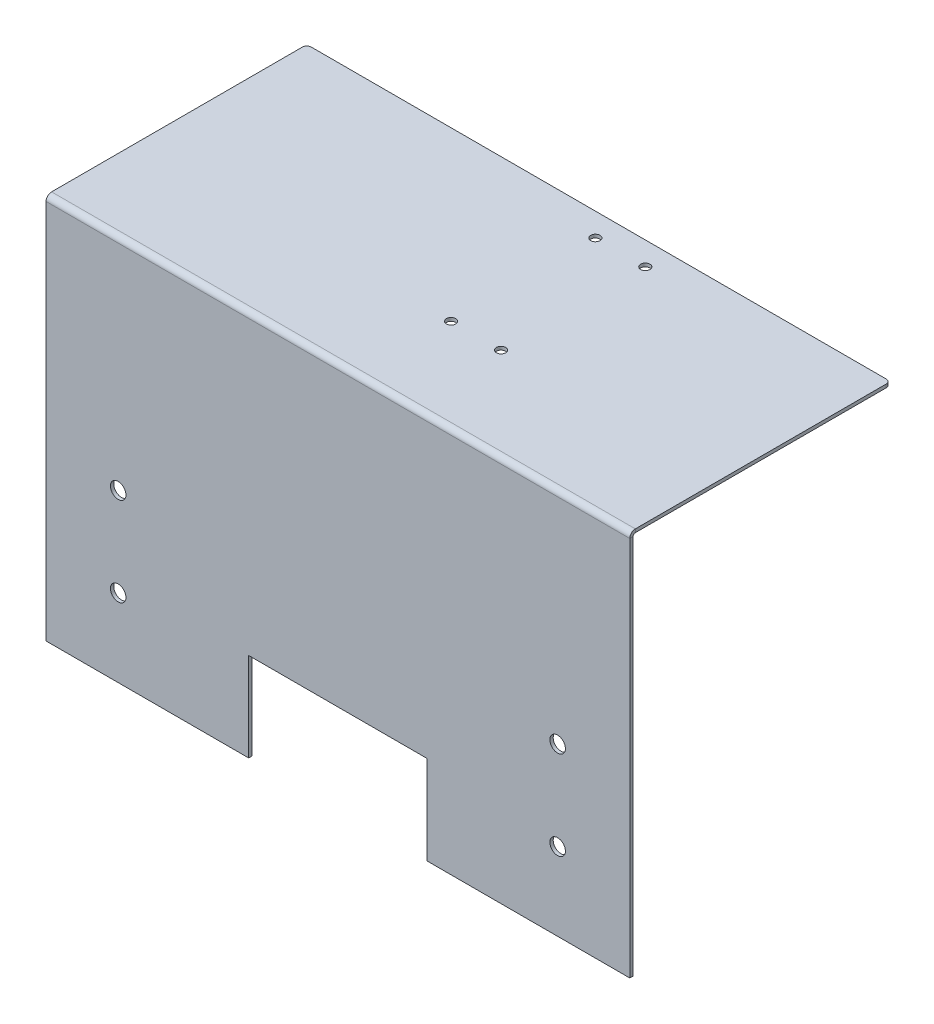
ISO-10303-21;
HEADER;
FILE_DESCRIPTION(('STEP AP214'),'2;1');
FILE_NAME('part.step','',(''),(''),'','','');
FILE_SCHEMA(('AUTOMOTIVE_DESIGN { 1 0 10303 214 1 1 1 1 }'));
ENDSEC;
DATA;
#1=APPLICATION_CONTEXT('core data for automotive mechanical design processes');
#2=APPLICATION_PROTOCOL_DEFINITION('international standard','automotive_design',2000,#1);
#3=PRODUCT_CONTEXT('',#1,'mechanical');
#4=PRODUCT('Part','Part','',(#3));
#5=PRODUCT_RELATED_PRODUCT_CATEGORY('part','',(#4));
#6=PRODUCT_DEFINITION_FORMATION('','',#4);
#7=PRODUCT_DEFINITION_CONTEXT('part definition',#1,'design');
#8=PRODUCT_DEFINITION('design','',#6,#7);
#9=PRODUCT_DEFINITION_SHAPE('','',#8);
#10=(LENGTH_UNIT() NAMED_UNIT(*) SI_UNIT(.MILLI.,.METRE.));
#11=(NAMED_UNIT(*) PLANE_ANGLE_UNIT() SI_UNIT($,.RADIAN.));
#12=(NAMED_UNIT(*) SI_UNIT($,.STERADIAN.) SOLID_ANGLE_UNIT());
#13=UNCERTAINTY_MEASURE_WITH_UNIT(LENGTH_MEASURE(1.E-05),#10,'distance_accuracy_value','');
#14=(GEOMETRIC_REPRESENTATION_CONTEXT(3) GLOBAL_UNCERTAINTY_ASSIGNED_CONTEXT((#13)) GLOBAL_UNIT_ASSIGNED_CONTEXT((#10,
#11,#12)) REPRESENTATION_CONTEXT('',''));
#15=CARTESIAN_POINT('',(0.,0.,0.));
#16=DIRECTION('',(0.,0.,1.));
#17=DIRECTION('',(1.,0.,0.));
#18=AXIS2_PLACEMENT_3D('',#15,#16,#17);
#19=CARTESIAN_POINT('',(131.5,0.,-1.5));
#20=DIRECTION('',(0.,-1.,0.));
#21=DIRECTION('',(0.,0.,-1.));
#22=AXIS2_PLACEMENT_3D('',#19,#20,#21);
#23=PLANE('',#22);
#24=DIRECTION('',(0.,0.,1.));
#25=VECTOR('',#24,1.);
#26=CARTESIAN_POINT('',(40.2,0.,-1.5));
#27=LINE('',#26,#25);
#28=CARTESIAN_POINT('',(40.2,0.,-1.50000000000003));
#29=VERTEX_POINT('',#28);
#30=CARTESIAN_POINT('',(40.2,0.,0.));
#31=VERTEX_POINT('',#30);
#32=EDGE_CURVE('E162',#29,#31,#27,.T.);
#33=ORIENTED_EDGE('',*,*,#32,.F.);
#34=DIRECTION('',(-1.,0.,0.));
#35=VECTOR('',#34,1.);
#36=CARTESIAN_POINT('',(131.5,0.,-1.5));
#37=LINE('',#36,#35);
#38=CARTESIAN_POINT('',(131.5,0.,-1.5));
#39=VERTEX_POINT('',#38);
#40=EDGE_CURVE('E251',#39,#29,#37,.T.);
#41=ORIENTED_EDGE('',*,*,#40,.F.);
#42=DIRECTION('',(0.,0.,1.));
#43=VECTOR('',#42,1.);
#44=CARTESIAN_POINT('',(131.5,0.,-1.5));
#45=LINE('',#44,#43);
#46=CARTESIAN_POINT('',(131.5,0.,0.));
#47=VERTEX_POINT('',#46);
#48=EDGE_CURVE('E217',#39,#47,#45,.T.);
#49=ORIENTED_EDGE('',*,*,#48,.T.);
#50=DIRECTION('',(-1.,0.,0.));
#51=VECTOR('',#50,1.);
#52=CARTESIAN_POINT('',(131.5,0.,0.));
#53=LINE('',#52,#51);
#54=EDGE_CURVE('E255',#47,#31,#53,.T.);
#55=ORIENTED_EDGE('',*,*,#54,.T.);
#56=EDGE_LOOP('',(#33,#41,#49,#55));
#57=FACE_BOUND('',#56,.T.);
#58=ADVANCED_FACE('F39',(#57),#23,.T.);
#59=CARTESIAN_POINT('',(131.5,0.,-1.5));
#60=DIRECTION('',(0.,0.,1.));
#61=DIRECTION('',(1.,0.,0.));
#62=AXIS2_PLACEMENT_3D('',#59,#60,#61);
#63=PLANE('',#62);
#64=ORIENTED_EDGE('',*,*,#40,.T.);
#65=DIRECTION('',(0.,1.,0.));
#66=VECTOR('',#65,1.);
#67=CARTESIAN_POINT('',(40.2,0.,-1.5));
#68=LINE('',#67,#66);
#69=CARTESIAN_POINT('',(40.2,40.,-1.50000000000003));
#70=VERTEX_POINT('',#69);
#71=EDGE_CURVE('E178',#29,#70,#68,.T.);
#72=ORIENTED_EDGE('',*,*,#71,.T.);
#73=DIRECTION('',(-1.,0.,0.));
#74=VECTOR('',#73,1.);
#75=CARTESIAN_POINT('',(131.5,40.,-1.5));
#76=LINE('',#75,#74);
#77=CARTESIAN_POINT('',(-40.2,40.,-1.50000000000003));
#78=VERTEX_POINT('',#77);
#79=EDGE_CURVE('E152',#70,#78,#76,.T.);
#80=ORIENTED_EDGE('',*,*,#79,.T.);
#81=DIRECTION('',(0.,-1.,0.));
#82=VECTOR('',#81,1.);
#83=CARTESIAN_POINT('',(-40.2,0.,-1.5));
#84=LINE('',#83,#82);
#85=CARTESIAN_POINT('',(-40.2,0.,-1.50000000000003));
#86=VERTEX_POINT('',#85);
#87=EDGE_CURVE('E174',#78,#86,#84,.T.);
#88=ORIENTED_EDGE('',*,*,#87,.T.);
#89=CARTESIAN_POINT('',(-131.5,0.,-1.5));
#90=VERTEX_POINT('',#89);
#91=EDGE_CURVE('E250',#86,#90,#37,.T.);
#92=ORIENTED_EDGE('',*,*,#91,.T.);
#93=DIRECTION('',(0.,1.,0.));
#94=VECTOR('',#93,1.);
#95=CARTESIAN_POINT('',(-131.5,0.,-1.5));
#96=LINE('',#95,#94);
#97=CARTESIAN_POINT('',(-131.5,171.5,-1.5));
#98=VERTEX_POINT('',#97);
#99=EDGE_CURVE('E240',#90,#98,#96,.T.);
#100=ORIENTED_EDGE('',*,*,#99,.T.);
#101=DIRECTION('',(-1.,0.,0.));
#102=VECTOR('',#101,1.);
#103=CARTESIAN_POINT('',(131.5,171.5,-1.5));
#104=LINE('',#103,#102);
#105=CARTESIAN_POINT('',(131.5,171.5,-1.5));
#106=VERTEX_POINT('',#105);
#107=EDGE_CURVE('E247',#106,#98,#104,.T.);
#108=ORIENTED_EDGE('',*,*,#107,.F.);
#109=DIRECTION('',(0.,1.,0.));
#110=VECTOR('',#109,1.);
#111=CARTESIAN_POINT('',(131.5,0.,-1.5));
#112=LINE('',#111,#110);
#113=EDGE_CURVE('E220',#39,#106,#112,.T.);
#114=ORIENTED_EDGE('',*,*,#113,.F.);
#115=EDGE_LOOP('',(#64,#72,#80,#88,#92,#100,#108,#114));
#116=FACE_BOUND('',#115,.T.);
#117=CARTESIAN_POINT('',(99.,75.,-1.5));
#118=DIRECTION('',(0.,0.,-1.));
#119=DIRECTION('',(-1.,0.,0.));
#120=AXIS2_PLACEMENT_3D('',#117,#118,#119);
#121=CIRCLE('',#120,3.49999999999999);
#122=CARTESIAN_POINT('',(95.5,75.,-1.5));
#123=VERTEX_POINT('',#122);
#124=EDGE_CURVE('E181',#123,#123,#121,.T.);
#125=ORIENTED_EDGE('',*,*,#124,.F.);
#126=EDGE_LOOP('',(#125));
#127=FACE_BOUND('',#126,.T.);
#128=CARTESIAN_POINT('',(-99.,75.,-1.5));
#129=DIRECTION('',(0.,0.,-1.));
#130=DIRECTION('',(-1.,0.,0.));
#131=AXIS2_PLACEMENT_3D('',#128,#129,#130);
#132=CIRCLE('',#131,3.49999999999999);
#133=CARTESIAN_POINT('',(-102.5,75.,-1.5));
#134=VERTEX_POINT('',#133);
#135=EDGE_CURVE('E199',#134,#134,#132,.T.);
#136=ORIENTED_EDGE('',*,*,#135,.F.);
#137=EDGE_LOOP('',(#136));
#138=FACE_BOUND('',#137,.T.);
#139=CARTESIAN_POINT('',(-99.,35.,-1.5));
#140=DIRECTION('',(0.,0.,-1.));
#141=DIRECTION('',(-1.,0.,0.));
#142=AXIS2_PLACEMENT_3D('',#139,#140,#141);
#143=CIRCLE('',#142,3.49999999999999);
#144=CARTESIAN_POINT('',(-102.5,35.,-1.5));
#145=VERTEX_POINT('',#144);
#146=EDGE_CURVE('E193',#145,#145,#143,.T.);
#147=ORIENTED_EDGE('',*,*,#146,.F.);
#148=EDGE_LOOP('',(#147));
#149=FACE_BOUND('',#148,.T.);
#150=CARTESIAN_POINT('',(99.,35.,-1.5));
#151=DIRECTION('',(0.,0.,-1.));
#152=DIRECTION('',(-1.,0.,0.));
#153=AXIS2_PLACEMENT_3D('',#150,#151,#152);
#154=CIRCLE('',#153,3.49999999999999);
#155=CARTESIAN_POINT('',(95.5,35.,-1.5));
#156=VERTEX_POINT('',#155);
#157=EDGE_CURVE('E187',#156,#156,#154,.T.);
#158=ORIENTED_EDGE('',*,*,#157,.F.);
#159=EDGE_LOOP('',(#158));
#160=FACE_BOUND('',#159,.T.);
#161=ADVANCED_FACE('F323',(#116,#127,#138,#149,#160),#63,.F.);
#162=CARTESIAN_POINT('',(131.5,174.,-2.5));
#163=DIRECTION('',(1.,0.,0.));
#164=DIRECTION('',(0.,0.,-1.));
#165=AXIS2_PLACEMENT_3D('',#162,#163,#164);
#166=PLANE('',#165);
#167=DIRECTION('',(0.,-1.,0.));
#168=VECTOR('',#167,1.);
#169=CARTESIAN_POINT('',(131.5,174.,-2.5));
#170=LINE('',#169,#168);
#171=CARTESIAN_POINT('',(131.5,174.,-2.5));
#172=VERTEX_POINT('',#171);
#173=CARTESIAN_POINT('',(131.5,172.5,-2.5));
#174=VERTEX_POINT('',#173);
#175=EDGE_CURVE('E274',#172,#174,#170,.T.);
#176=ORIENTED_EDGE('',*,*,#175,.F.);
#177=CARTESIAN_POINT('',(131.5,171.5,-2.5));
#178=DIRECTION('',(1.,0.,0.));
#179=DIRECTION('',(0.,0.,-1.));
#180=AXIS2_PLACEMENT_3D('',#177,#178,#179);
#181=CIRCLE('',#180,2.5);
#182=CARTESIAN_POINT('',(131.5,171.5,0.));
#183=VERTEX_POINT('',#182);
#184=EDGE_CURVE('E211',#183,#172,#181,.F.);
#185=ORIENTED_EDGE('',*,*,#184,.F.);
#186=DIRECTION('',(0.,0.,1.));
#187=VECTOR('',#186,1.);
#188=CARTESIAN_POINT('',(131.5,171.5,-1.5));
#189=LINE('',#188,#187);
#190=EDGE_CURVE('E272',#106,#183,#189,.T.);
#191=ORIENTED_EDGE('',*,*,#190,.F.);
#192=CARTESIAN_POINT('',(131.5,171.5,-2.5));
#193=DIRECTION('',(1.,0.,0.));
#194=DIRECTION('',(0.,0.,-1.));
#195=AXIS2_PLACEMENT_3D('',#192,#193,#194);
#196=CIRCLE('',#195,1.);
#197=EDGE_CURVE('E223',#106,#174,#196,.F.);
#198=ORIENTED_EDGE('',*,*,#197,.T.);
#199=EDGE_LOOP('',(#176,#185,#191,#198));
#200=FACE_BOUND('',#199,.T.);
#201=ADVANCED_FACE('F308',(#200),#166,.T.);
#202=CARTESIAN_POINT('',(131.5,171.5,-1.5));
#203=DIRECTION('',(1.,0.,0.));
#204=DIRECTION('',(0.,0.,-1.));
#205=AXIS2_PLACEMENT_3D('',#202,#203,#204);
#206=PLANE('',#205);
#207=DIRECTION('',(0.,0.,-1.));
#208=VECTOR('',#207,1.);
#209=CARTESIAN_POINT('',(131.5,172.5,0.));
#210=LINE('',#209,#208);
#211=CARTESIAN_POINT('',(131.5,172.5,-115.5));
#212=VERTEX_POINT('',#211);
#213=EDGE_CURVE('E206',#174,#212,#210,.T.);
#214=ORIENTED_EDGE('',*,*,#213,.T.);
#215=DIRECTION('',(0.,-1.,0.));
#216=VECTOR('',#215,1.);
#217=CARTESIAN_POINT('',(131.5,171.5,-115.5));
#218=LINE('',#217,#216);
#219=CARTESIAN_POINT('',(131.5,174.,-115.5));
#220=VERTEX_POINT('',#219);
#221=EDGE_CURVE('E62',#212,#220,#218,.F.);
#222=ORIENTED_EDGE('',*,*,#221,.T.);
#223=DIRECTION('',(0.,0.,-1.));
#224=VECTOR('',#223,1.);
#225=CARTESIAN_POINT('',(131.5,174.,0.));
#226=LINE('',#225,#224);
#227=EDGE_CURVE('E208',#172,#220,#226,.T.);
#228=ORIENTED_EDGE('',*,*,#227,.F.);
#229=ORIENTED_EDGE('',*,*,#175,.T.);
#230=EDGE_LOOP('',(#214,#222,#228,#229));
#231=FACE_BOUND('',#230,.T.);
#232=ADVANCED_FACE('F303',(#231),#206,.T.);
#233=CARTESIAN_POINT('',(-131.5,171.5,0.));
#234=DIRECTION('',(-1.,0.,0.));
#235=DIRECTION('',(0.,0.,1.));
#236=AXIS2_PLACEMENT_3D('',#233,#234,#235);
#237=PLANE('',#236);
#238=DIRECTION('',(0.,0.,-1.));
#239=VECTOR('',#238,1.);
#240=CARTESIAN_POINT('',(-131.5,171.5,0.));
#241=LINE('',#240,#239);
#242=CARTESIAN_POINT('',(-131.5,171.5,0.));
#243=VERTEX_POINT('',#242);
#244=EDGE_CURVE('E270',#243,#98,#241,.T.);
#245=ORIENTED_EDGE('',*,*,#244,.F.);
#246=CARTESIAN_POINT('',(-131.5,171.5,-2.5));
#247=DIRECTION('',(1.,0.,0.));
#248=DIRECTION('',(0.,0.,-1.));
#249=AXIS2_PLACEMENT_3D('',#246,#247,#248);
#250=CIRCLE('',#249,2.5);
#251=CARTESIAN_POINT('',(-131.5,174.,-2.5));
#252=VERTEX_POINT('',#251);
#253=EDGE_CURVE('E231',#243,#252,#250,.F.);
#254=ORIENTED_EDGE('',*,*,#253,.T.);
#255=DIRECTION('',(0.,1.,0.));
#256=VECTOR('',#255,1.);
#257=CARTESIAN_POINT('',(-131.5,172.5,-2.5));
#258=LINE('',#257,#256);
#259=CARTESIAN_POINT('',(-131.5,172.5,-2.5));
#260=VERTEX_POINT('',#259);
#261=EDGE_CURVE('E268',#260,#252,#258,.T.);
#262=ORIENTED_EDGE('',*,*,#261,.F.);
#263=CARTESIAN_POINT('',(-131.5,171.5,-2.5));
#264=DIRECTION('',(1.,0.,0.));
#265=DIRECTION('',(0.,0.,-1.));
#266=AXIS2_PLACEMENT_3D('',#263,#264,#265);
#267=CIRCLE('',#266,1.);
#268=EDGE_CURVE('E209',#98,#260,#267,.F.);
#269=ORIENTED_EDGE('',*,*,#268,.F.);
#270=EDGE_LOOP('',(#245,#254,#262,#269));
#271=FACE_BOUND('',#270,.T.);
#272=ADVANCED_FACE('F356',(#271),#237,.T.);
#273=CARTESIAN_POINT('',(-131.5,172.5,-2.5));
#274=DIRECTION('',(-1.,0.,0.));
#275=DIRECTION('',(0.,0.,1.));
#276=AXIS2_PLACEMENT_3D('',#273,#274,#275);
#277=PLANE('',#276);
#278=DIRECTION('',(0.,1.,0.));
#279=VECTOR('',#278,1.);
#280=CARTESIAN_POINT('',(-131.5,0.,0.));
#281=LINE('',#280,#279);
#282=CARTESIAN_POINT('',(-131.5,0.,0.));
#283=VERTEX_POINT('',#282);
#284=EDGE_CURVE('E234',#283,#243,#281,.T.);
#285=ORIENTED_EDGE('',*,*,#284,.T.);
#286=ORIENTED_EDGE('',*,*,#244,.T.);
#287=ORIENTED_EDGE('',*,*,#99,.F.);
#288=DIRECTION('',(0.,0.,1.));
#289=VECTOR('',#288,1.);
#290=CARTESIAN_POINT('',(-131.5,0.,-1.5));
#291=LINE('',#290,#289);
#292=EDGE_CURVE('E237',#90,#283,#291,.T.);
#293=ORIENTED_EDGE('',*,*,#292,.T.);
#294=EDGE_LOOP('',(#285,#286,#287,#293));
#295=FACE_BOUND('',#294,.T.);
#296=ADVANCED_FACE('F351',(#295),#277,.T.);
#297=CARTESIAN_POINT('',(131.5,172.5,0.));
#298=DIRECTION('',(0.,1.,0.));
#299=DIRECTION('',(0.,0.,1.));
#300=AXIS2_PLACEMENT_3D('',#297,#298,#299);
#301=PLANE('',#300);
#302=CARTESIAN_POINT('',(9.,172.5,-107.));
#303=DIRECTION('',(0.,1.,0.));
#304=DIRECTION('',(0.,0.,1.));
#305=AXIS2_PLACEMENT_3D('',#302,#303,#304);
#306=CIRCLE('',#305,2.1);
#307=CARTESIAN_POINT('',(9.,172.5,-104.9));
#308=VERTEX_POINT('',#307);
#309=EDGE_CURVE('E652',#308,#308,#306,.T.);
#310=ORIENTED_EDGE('',*,*,#309,.T.);
#311=EDGE_LOOP('',(#310));
#312=FACE_BOUND('',#311,.T.);
#313=CARTESIAN_POINT('',(31.5,172.5,-107.));
#314=DIRECTION('',(0.,1.,0.));
#315=DIRECTION('',(0.,0.,1.));
#316=AXIS2_PLACEMENT_3D('',#313,#314,#315);
#317=CIRCLE('',#316,2.1);
#318=CARTESIAN_POINT('',(31.5,172.5,-104.9));
#319=VERTEX_POINT('',#318);
#320=EDGE_CURVE('E648',#319,#319,#317,.T.);
#321=ORIENTED_EDGE('',*,*,#320,.T.);
#322=EDGE_LOOP('',(#321));
#323=FACE_BOUND('',#322,.T.);
#324=CARTESIAN_POINT('',(31.5,172.5,-42.));
#325=DIRECTION('',(0.,1.,0.));
#326=DIRECTION('',(0.,0.,1.));
#327=AXIS2_PLACEMENT_3D('',#324,#325,#326);
#328=CIRCLE('',#327,2.1);
#329=CARTESIAN_POINT('',(31.5,172.5,-39.9));
#330=VERTEX_POINT('',#329);
#331=EDGE_CURVE('E641',#330,#330,#328,.T.);
#332=ORIENTED_EDGE('',*,*,#331,.T.);
#333=EDGE_LOOP('',(#332));
#334=FACE_BOUND('',#333,.T.);
#335=CARTESIAN_POINT('',(9.00000000000001,172.5,-42.));
#336=DIRECTION('',(0.,1.,0.));
#337=DIRECTION('',(0.,0.,1.));
#338=AXIS2_PLACEMENT_3D('',#335,#336,#337);
#339=CIRCLE('',#338,2.1);
#340=CARTESIAN_POINT('',(9.00000000000001,172.5,-39.9));
#341=VERTEX_POINT('',#340);
#342=EDGE_CURVE('E165',#341,#341,#339,.T.);
#343=ORIENTED_EDGE('',*,*,#342,.T.);
#344=EDGE_LOOP('',(#343));
#345=FACE_BOUND('',#344,.T.);
#346=DIRECTION('',(-1.,0.,0.));
#347=VECTOR('',#346,1.);
#348=CARTESIAN_POINT('',(131.5,172.5,-117.5));
#349=LINE('',#348,#347);
#350=CARTESIAN_POINT('',(129.5,172.5,-117.5));
#351=VERTEX_POINT('',#350);
#352=CARTESIAN_POINT('',(-129.5,172.5,-117.5));
#353=VERTEX_POINT('',#352);
#354=EDGE_CURVE('E265',#351,#353,#349,.T.);
#355=ORIENTED_EDGE('',*,*,#354,.F.);
#356=CARTESIAN_POINT('',(129.5,172.5,-115.5));
#357=DIRECTION('',(0.,1.,0.));
#358=DIRECTION('',(0.,0.,1.));
#359=AXIS2_PLACEMENT_3D('',#356,#357,#358);
#360=CIRCLE('',#359,2.);
#361=EDGE_CURVE('E286',#351,#212,#360,.F.);
#362=ORIENTED_EDGE('',*,*,#361,.T.);
#363=ORIENTED_EDGE('',*,*,#213,.F.);
#364=DIRECTION('',(-1.,0.,0.));
#365=VECTOR('',#364,1.);
#366=CARTESIAN_POINT('',(131.5,172.5,-2.5));
#367=LINE('',#366,#365);
#368=EDGE_CURVE('E226',#174,#260,#367,.T.);
#369=ORIENTED_EDGE('',*,*,#368,.T.);
#370=DIRECTION('',(0.,0.,-1.));
#371=VECTOR('',#370,1.);
#372=CARTESIAN_POINT('',(-131.5,172.5,0.));
#373=LINE('',#372,#371);
#374=CARTESIAN_POINT('',(-131.5,172.5,-115.5));
#375=VERTEX_POINT('',#374);
#376=EDGE_CURVE('E205',#260,#375,#373,.T.);
#377=ORIENTED_EDGE('',*,*,#376,.T.);
#378=CARTESIAN_POINT('',(-129.5,172.5,-115.5));
#379=DIRECTION('',(0.,1.,0.));
#380=DIRECTION('',(0.,0.,1.));
#381=AXIS2_PLACEMENT_3D('',#378,#379,#380);
#382=CIRCLE('',#381,2.);
#383=EDGE_CURVE('E284',#375,#353,#382,.F.);
#384=ORIENTED_EDGE('',*,*,#383,.T.);
#385=EDGE_LOOP('',(#355,#362,#363,#369,#377,#384));
#386=FACE_BOUND('',#385,.T.);
#387=ADVANCED_FACE('F302',(#312,#323,#334,#345,#386),#301,.F.);
#388=CARTESIAN_POINT('',(131.5,174.,-117.5));
#389=DIRECTION('',(0.,0.,-1.));
#390=DIRECTION('',(-1.,0.,0.));
#391=AXIS2_PLACEMENT_3D('',#388,#389,#390);
#392=PLANE('',#391);
#393=DIRECTION('',(-1.,0.,0.));
#394=VECTOR('',#393,1.);
#395=CARTESIAN_POINT('',(131.5,174.,-117.5));
#396=LINE('',#395,#394);
#397=CARTESIAN_POINT('',(129.5,174.,-117.5));
#398=VERTEX_POINT('',#397);
#399=CARTESIAN_POINT('',(-129.5,174.,-117.5));
#400=VERTEX_POINT('',#399);
#401=EDGE_CURVE('E263',#398,#400,#396,.T.);
#402=ORIENTED_EDGE('',*,*,#401,.F.);
#403=DIRECTION('',(0.,-1.,0.));
#404=VECTOR('',#403,1.);
#405=CARTESIAN_POINT('',(129.5,174.,-117.5));
#406=LINE('',#405,#404);
#407=EDGE_CURVE('E281',#398,#351,#406,.T.);
#408=ORIENTED_EDGE('',*,*,#407,.T.);
#409=ORIENTED_EDGE('',*,*,#354,.T.);
#410=DIRECTION('',(0.,-1.,0.));
#411=VECTOR('',#410,1.);
#412=CARTESIAN_POINT('',(-129.5,174.,-117.5));
#413=LINE('',#412,#411);
#414=EDGE_CURVE('E279',#353,#400,#413,.F.);
#415=ORIENTED_EDGE('',*,*,#414,.T.);
#416=EDGE_LOOP('',(#402,#408,#409,#415));
#417=FACE_BOUND('',#416,.T.);
#418=ADVANCED_FACE('F296',(#417),#392,.T.);
#419=CARTESIAN_POINT('',(131.5,174.,0.));
#420=DIRECTION('',(0.,1.,0.));
#421=DIRECTION('',(0.,0.,1.));
#422=AXIS2_PLACEMENT_3D('',#419,#420,#421);
#423=PLANE('',#422);
#424=CARTESIAN_POINT('',(9.,174.,-107.));
#425=DIRECTION('',(0.,1.,0.));
#426=DIRECTION('',(0.,0.,1.));
#427=AXIS2_PLACEMENT_3D('',#424,#425,#426);
#428=CIRCLE('',#427,2.1);
#429=CARTESIAN_POINT('',(9.,174.,-104.9));
#430=VERTEX_POINT('',#429);
#431=EDGE_CURVE('E628',#430,#430,#428,.T.);
#432=ORIENTED_EDGE('',*,*,#431,.F.);
#433=EDGE_LOOP('',(#432));
#434=FACE_BOUND('',#433,.T.);
#435=CARTESIAN_POINT('',(31.5,174.,-107.));
#436=DIRECTION('',(0.,1.,0.));
#437=DIRECTION('',(0.,0.,1.));
#438=AXIS2_PLACEMENT_3D('',#435,#436,#437);
#439=CIRCLE('',#438,2.1);
#440=CARTESIAN_POINT('',(31.5,174.,-104.9));
#441=VERTEX_POINT('',#440);
#442=EDGE_CURVE('E632',#441,#441,#439,.T.);
#443=ORIENTED_EDGE('',*,*,#442,.F.);
#444=EDGE_LOOP('',(#443));
#445=FACE_BOUND('',#444,.T.);
#446=CARTESIAN_POINT('',(31.5,174.,-42.));
#447=DIRECTION('',(0.,1.,0.));
#448=DIRECTION('',(0.,0.,1.));
#449=AXIS2_PLACEMENT_3D('',#446,#447,#448);
#450=CIRCLE('',#449,2.1);
#451=CARTESIAN_POINT('',(31.5,174.,-39.9));
#452=VERTEX_POINT('',#451);
#453=EDGE_CURVE('E636',#452,#452,#450,.T.);
#454=ORIENTED_EDGE('',*,*,#453,.F.);
#455=EDGE_LOOP('',(#454));
#456=FACE_BOUND('',#455,.T.);
#457=CARTESIAN_POINT('',(9.00000000000001,174.,-42.));
#458=DIRECTION('',(0.,1.,0.));
#459=DIRECTION('',(0.,0.,1.));
#460=AXIS2_PLACEMENT_3D('',#457,#458,#459);
#461=CIRCLE('',#460,2.1);
#462=CARTESIAN_POINT('',(9.00000000000001,174.,-39.9));
#463=VERTEX_POINT('',#462);
#464=EDGE_CURVE('E639',#463,#463,#461,.T.);
#465=ORIENTED_EDGE('',*,*,#464,.F.);
#466=EDGE_LOOP('',(#465));
#467=FACE_BOUND('',#466,.T.);
#468=ORIENTED_EDGE('',*,*,#227,.T.);
#469=CARTESIAN_POINT('',(129.5,174.,-115.5));
#470=DIRECTION('',(0.,1.,0.));
#471=DIRECTION('',(0.,0.,1.));
#472=AXIS2_PLACEMENT_3D('',#469,#470,#471);
#473=CIRCLE('',#472,2.);
#474=EDGE_CURVE('E47',#220,#398,#473,.T.);
#475=ORIENTED_EDGE('',*,*,#474,.T.);
#476=ORIENTED_EDGE('',*,*,#401,.T.);
#477=CARTESIAN_POINT('',(-129.5,174.,-115.5));
#478=DIRECTION('',(0.,1.,0.));
#479=DIRECTION('',(0.,0.,1.));
#480=AXIS2_PLACEMENT_3D('',#477,#478,#479);
#481=CIRCLE('',#480,2.);
#482=CARTESIAN_POINT('',(-131.5,174.,-115.5));
#483=VERTEX_POINT('',#482);
#484=EDGE_CURVE('E54',#400,#483,#481,.T.);
#485=ORIENTED_EDGE('',*,*,#484,.T.);
#486=DIRECTION('',(0.,0.,-1.));
#487=VECTOR('',#486,1.);
#488=CARTESIAN_POINT('',(-131.5,174.,0.));
#489=LINE('',#488,#487);
#490=EDGE_CURVE('E229',#252,#483,#489,.T.);
#491=ORIENTED_EDGE('',*,*,#490,.F.);
#492=DIRECTION('',(-1.,0.,0.));
#493=VECTOR('',#492,1.);
#494=CARTESIAN_POINT('',(131.5,174.,-2.5));
#495=LINE('',#494,#493);
#496=EDGE_CURVE('E260',#172,#252,#495,.T.);
#497=ORIENTED_EDGE('',*,*,#496,.F.);
#498=EDGE_LOOP('',(#468,#475,#476,#485,#491,#497));
#499=FACE_BOUND('',#498,.T.);
#500=ADVANCED_FACE('F291',(#434,#445,#456,#467,#499),#423,.T.);
#501=CARTESIAN_POINT('',(131.5,171.5,-2.5));
#502=DIRECTION('',(-1.,0.,0.));
#503=DIRECTION('',(0.,0.,1.));
#504=AXIS2_PLACEMENT_3D('',#501,#502,#503);
#505=CYLINDRICAL_SURFACE('',#504,2.5);
#506=ORIENTED_EDGE('',*,*,#253,.F.);
#507=DIRECTION('',(-1.,0.,0.));
#508=VECTOR('',#507,1.);
#509=CARTESIAN_POINT('',(131.5,171.5,0.));
#510=LINE('',#509,#508);
#511=EDGE_CURVE('E257',#183,#243,#510,.T.);
#512=ORIENTED_EDGE('',*,*,#511,.F.);
#513=ORIENTED_EDGE('',*,*,#184,.T.);
#514=ORIENTED_EDGE('',*,*,#496,.T.);
#515=EDGE_LOOP('',(#506,#512,#513,#514));
#516=FACE_BOUND('',#515,.T.);
#517=ADVANCED_FACE('F341',(#516),#505,.T.);
#518=CARTESIAN_POINT('',(131.5,0.,0.));
#519=DIRECTION('',(0.,0.,1.));
#520=DIRECTION('',(1.,0.,0.));
#521=AXIS2_PLACEMENT_3D('',#518,#519,#520);
#522=PLANE('',#521);
#523=DIRECTION('',(0.,1.,0.));
#524=VECTOR('',#523,1.);
#525=CARTESIAN_POINT('',(40.2,40.,0.));
#526=LINE('',#525,#524);
#527=CARTESIAN_POINT('',(40.2,40.,0.));
#528=VERTEX_POINT('',#527);
#529=EDGE_CURVE('E159',#31,#528,#526,.T.);
#530=ORIENTED_EDGE('',*,*,#529,.F.);
#531=ORIENTED_EDGE('',*,*,#54,.F.);
#532=DIRECTION('',(0.,1.,0.));
#533=VECTOR('',#532,1.);
#534=CARTESIAN_POINT('',(131.5,0.,0.));
#535=LINE('',#534,#533);
#536=EDGE_CURVE('E214',#47,#183,#535,.T.);
#537=ORIENTED_EDGE('',*,*,#536,.T.);
#538=ORIENTED_EDGE('',*,*,#511,.T.);
#539=ORIENTED_EDGE('',*,*,#284,.F.);
#540=CARTESIAN_POINT('',(-40.2,0.,0.));
#541=VERTEX_POINT('',#540);
#542=EDGE_CURVE('E254',#541,#283,#53,.T.);
#543=ORIENTED_EDGE('',*,*,#542,.F.);
#544=DIRECTION('',(0.,-1.,0.));
#545=VECTOR('',#544,1.);
#546=CARTESIAN_POINT('',(-40.2,40.,0.));
#547=LINE('',#546,#545);
#548=CARTESIAN_POINT('',(-40.2,40.,0.));
#549=VERTEX_POINT('',#548);
#550=EDGE_CURVE('E156',#549,#541,#547,.T.);
#551=ORIENTED_EDGE('',*,*,#550,.F.);
#552=DIRECTION('',(-1.,0.,0.));
#553=VECTOR('',#552,1.);
#554=CARTESIAN_POINT('',(-40.2,40.,0.));
#555=LINE('',#554,#553);
#556=EDGE_CURVE('E149',#528,#549,#555,.T.);
#557=ORIENTED_EDGE('',*,*,#556,.F.);
#558=EDGE_LOOP('',(#530,#531,#537,#538,#539,#543,#551,#557));
#559=FACE_BOUND('',#558,.T.);
#560=CARTESIAN_POINT('',(99.,75.,0.));
#561=DIRECTION('',(0.,0.,1.));
#562=DIRECTION('',(1.,0.,0.));
#563=AXIS2_PLACEMENT_3D('',#560,#561,#562);
#564=CIRCLE('',#563,3.5);
#565=CARTESIAN_POINT('',(102.5,75.,0.));
#566=VERTEX_POINT('',#565);
#567=EDGE_CURVE('E184',#566,#566,#564,.T.);
#568=ORIENTED_EDGE('',*,*,#567,.F.);
#569=EDGE_LOOP('',(#568));
#570=FACE_BOUND('',#569,.T.);
#571=CARTESIAN_POINT('',(99.,35.,0.));
#572=DIRECTION('',(0.,0.,1.));
#573=DIRECTION('',(1.,0.,0.));
#574=AXIS2_PLACEMENT_3D('',#571,#572,#573);
#575=CIRCLE('',#574,3.5);
#576=CARTESIAN_POINT('',(102.5,35.,0.));
#577=VERTEX_POINT('',#576);
#578=EDGE_CURVE('E190',#577,#577,#575,.T.);
#579=ORIENTED_EDGE('',*,*,#578,.F.);
#580=EDGE_LOOP('',(#579));
#581=FACE_BOUND('',#580,.T.);
#582=CARTESIAN_POINT('',(-99.,35.,0.));
#583=DIRECTION('',(0.,0.,1.));
#584=DIRECTION('',(1.,0.,0.));
#585=AXIS2_PLACEMENT_3D('',#582,#583,#584);
#586=CIRCLE('',#585,3.5);
#587=CARTESIAN_POINT('',(-95.5,35.,0.));
#588=VERTEX_POINT('',#587);
#589=EDGE_CURVE('E196',#588,#588,#586,.T.);
#590=ORIENTED_EDGE('',*,*,#589,.F.);
#591=EDGE_LOOP('',(#590));
#592=FACE_BOUND('',#591,.T.);
#593=CARTESIAN_POINT('',(-99.,75.,0.));
#594=DIRECTION('',(0.,0.,1.));
#595=DIRECTION('',(1.,0.,0.));
#596=AXIS2_PLACEMENT_3D('',#593,#594,#595);
#597=CIRCLE('',#596,3.5);
#598=CARTESIAN_POINT('',(-95.5,75.,0.));
#599=VERTEX_POINT('',#598);
#600=EDGE_CURVE('E202',#599,#599,#597,.T.);
#601=ORIENTED_EDGE('',*,*,#600,.F.);
#602=EDGE_LOOP('',(#601));
#603=FACE_BOUND('',#602,.T.);
#604=ADVANCED_FACE('F167',(#559,#570,#581,#592,#603),#522,.T.);
#605=DIRECTION('',(0.,0.,-1.));
#606=VECTOR('',#605,1.);
#607=CARTESIAN_POINT('',(-40.2,0.,-1.5));
#608=LINE('',#607,#606);
#609=EDGE_CURVE('E276',#541,#86,#608,.T.);
#610=ORIENTED_EDGE('',*,*,#609,.F.);
#611=ORIENTED_EDGE('',*,*,#542,.T.);
#612=ORIENTED_EDGE('',*,*,#292,.F.);
#613=ORIENTED_EDGE('',*,*,#91,.F.);
#614=EDGE_LOOP('',(#610,#611,#612,#613));
#615=FACE_BOUND('',#614,.T.);
#616=ADVANCED_FACE('F326',(#615),#23,.T.);
#617=CARTESIAN_POINT('',(131.5,171.5,-2.5));
#618=DIRECTION('',(-1.,0.,0.));
#619=DIRECTION('',(0.,0.,1.));
#620=AXIS2_PLACEMENT_3D('',#617,#618,#619);
#621=CYLINDRICAL_SURFACE('',#620,1.);
#622=ORIENTED_EDGE('',*,*,#268,.T.);
#623=ORIENTED_EDGE('',*,*,#368,.F.);
#624=ORIENTED_EDGE('',*,*,#197,.F.);
#625=ORIENTED_EDGE('',*,*,#107,.T.);
#626=EDGE_LOOP('',(#622,#623,#624,#625));
#627=FACE_BOUND('',#626,.T.);
#628=ADVANCED_FACE('F310',(#627),#621,.F.);
#629=CARTESIAN_POINT('',(131.5,171.5,-2.5));
#630=DIRECTION('',(1.,0.,0.));
#631=DIRECTION('',(0.,0.,-1.));
#632=AXIS2_PLACEMENT_3D('',#629,#630,#631);
#633=PLANE('',#632);
#634=ORIENTED_EDGE('',*,*,#113,.T.);
#635=ORIENTED_EDGE('',*,*,#190,.T.);
#636=ORIENTED_EDGE('',*,*,#536,.F.);
#637=ORIENTED_EDGE('',*,*,#48,.F.);
#638=EDGE_LOOP('',(#634,#635,#636,#637));
#639=FACE_BOUND('',#638,.T.);
#640=ADVANCED_FACE('F339',(#639),#633,.T.);
#641=CARTESIAN_POINT('',(-131.5,171.5,-2.5));
#642=DIRECTION('',(1.,0.,0.));
#643=DIRECTION('',(0.,0.,-1.));
#644=AXIS2_PLACEMENT_3D('',#641,#642,#643);
#645=PLANE('',#644);
#646=ORIENTED_EDGE('',*,*,#490,.T.);
#647=DIRECTION('',(0.,-1.,0.));
#648=VECTOR('',#647,1.);
#649=CARTESIAN_POINT('',(-131.5,172.5,-115.5));
#650=LINE('',#649,#648);
#651=EDGE_CURVE('E11',#483,#375,#650,.T.);
#652=ORIENTED_EDGE('',*,*,#651,.T.);
#653=ORIENTED_EDGE('',*,*,#376,.F.);
#654=ORIENTED_EDGE('',*,*,#261,.T.);
#655=EDGE_LOOP('',(#646,#652,#653,#654));
#656=FACE_BOUND('',#655,.T.);
#657=ADVANCED_FACE('F314',(#656),#645,.F.);
#658=CARTESIAN_POINT('',(-99.,75.,-1.5));
#659=DIRECTION('',(0.,0.,-1.));
#660=DIRECTION('',(-1.,0.,0.));
#661=AXIS2_PLACEMENT_3D('',#658,#659,#660);
#662=CYLINDRICAL_SURFACE('',#661,3.5);
#663=ORIENTED_EDGE('',*,*,#135,.T.);
#664=EDGE_LOOP('',(#663));
#665=FACE_BOUND('',#664,.T.);
#666=ORIENTED_EDGE('',*,*,#600,.T.);
#667=EDGE_LOOP('',(#666));
#668=FACE_BOUND('',#667,.T.);
#669=ADVANCED_FACE('F388',(#665,#668),#662,.F.);
#670=CARTESIAN_POINT('',(-99.,35.,-1.5));
#671=DIRECTION('',(0.,0.,-1.));
#672=DIRECTION('',(-1.,0.,0.));
#673=AXIS2_PLACEMENT_3D('',#670,#671,#672);
#674=CYLINDRICAL_SURFACE('',#673,3.5);
#675=ORIENTED_EDGE('',*,*,#146,.T.);
#676=EDGE_LOOP('',(#675));
#677=FACE_BOUND('',#676,.T.);
#678=ORIENTED_EDGE('',*,*,#589,.T.);
#679=EDGE_LOOP('',(#678));
#680=FACE_BOUND('',#679,.T.);
#681=ADVANCED_FACE('F384',(#677,#680),#674,.F.);
#682=CARTESIAN_POINT('',(99.,35.,-1.5));
#683=DIRECTION('',(0.,0.,-1.));
#684=DIRECTION('',(-1.,0.,0.));
#685=AXIS2_PLACEMENT_3D('',#682,#683,#684);
#686=CYLINDRICAL_SURFACE('',#685,3.5);
#687=ORIENTED_EDGE('',*,*,#157,.T.);
#688=EDGE_LOOP('',(#687));
#689=FACE_BOUND('',#688,.T.);
#690=ORIENTED_EDGE('',*,*,#578,.T.);
#691=EDGE_LOOP('',(#690));
#692=FACE_BOUND('',#691,.T.);
#693=ADVANCED_FACE('F380',(#689,#692),#686,.F.);
#694=CARTESIAN_POINT('',(99.,75.,-1.5));
#695=DIRECTION('',(0.,0.,-1.));
#696=DIRECTION('',(-1.,0.,0.));
#697=AXIS2_PLACEMENT_3D('',#694,#695,#696);
#698=CYLINDRICAL_SURFACE('',#697,3.5);
#699=ORIENTED_EDGE('',*,*,#124,.T.);
#700=EDGE_LOOP('',(#699));
#701=FACE_BOUND('',#700,.T.);
#702=ORIENTED_EDGE('',*,*,#567,.T.);
#703=EDGE_LOOP('',(#702));
#704=FACE_BOUND('',#703,.T.);
#705=ADVANCED_FACE('F376',(#701,#704),#698,.F.);
#706=CARTESIAN_POINT('',(-40.2,40.,-117.5));
#707=DIRECTION('',(0.,1.,0.));
#708=DIRECTION('',(-1.,0.,0.));
#709=AXIS2_PLACEMENT_3D('',#706,#707,#708);
#710=PLANE('',#709);
#711=DIRECTION('',(0.,0.,1.));
#712=VECTOR('',#711,1.);
#713=CARTESIAN_POINT('',(40.2,40.,-117.5));
#714=LINE('',#713,#712);
#715=EDGE_CURVE('E144',#70,#528,#714,.T.);
#716=ORIENTED_EDGE('',*,*,#715,.T.);
#717=ORIENTED_EDGE('',*,*,#556,.T.);
#718=DIRECTION('',(0.,0.,1.));
#719=VECTOR('',#718,1.);
#720=CARTESIAN_POINT('',(-40.2,40.,-117.5));
#721=LINE('',#720,#719);
#722=EDGE_CURVE('E155',#78,#549,#721,.T.);
#723=ORIENTED_EDGE('',*,*,#722,.F.);
#724=ORIENTED_EDGE('',*,*,#79,.F.);
#725=EDGE_LOOP('',(#716,#717,#723,#724));
#726=FACE_BOUND('',#725,.T.);
#727=ADVANCED_FACE('F146',(#726),#710,.F.);
#728=CARTESIAN_POINT('',(40.2,40.,-117.5));
#729=DIRECTION('',(1.,0.,0.));
#730=DIRECTION('',(0.,0.,-1.));
#731=AXIS2_PLACEMENT_3D('',#728,#729,#730);
#732=PLANE('',#731);
#733=ORIENTED_EDGE('',*,*,#32,.T.);
#734=ORIENTED_EDGE('',*,*,#529,.T.);
#735=ORIENTED_EDGE('',*,*,#715,.F.);
#736=ORIENTED_EDGE('',*,*,#71,.F.);
#737=EDGE_LOOP('',(#733,#734,#735,#736));
#738=FACE_BOUND('',#737,.T.);
#739=ADVANCED_FACE('F160',(#738),#732,.F.);
#740=CARTESIAN_POINT('',(-40.2,40.,-117.5));
#741=DIRECTION('',(-1.,0.,0.));
#742=DIRECTION('',(0.,0.,1.));
#743=AXIS2_PLACEMENT_3D('',#740,#741,#742);
#744=PLANE('',#743);
#745=ORIENTED_EDGE('',*,*,#722,.T.);
#746=ORIENTED_EDGE('',*,*,#550,.T.);
#747=ORIENTED_EDGE('',*,*,#609,.T.);
#748=ORIENTED_EDGE('',*,*,#87,.F.);
#749=EDGE_LOOP('',(#745,#746,#747,#748));
#750=FACE_BOUND('',#749,.T.);
#751=ADVANCED_FACE('F361',(#750),#744,.F.);
#752=CARTESIAN_POINT('',(9.00000000000001,174.,-42.));
#753=DIRECTION('',(0.,1.,0.));
#754=DIRECTION('',(0.,0.,1.));
#755=AXIS2_PLACEMENT_3D('',#752,#753,#754);
#756=CYLINDRICAL_SURFACE('',#755,2.1);
#757=ORIENTED_EDGE('',*,*,#342,.F.);
#758=EDGE_LOOP('',(#757));
#759=FACE_BOUND('',#758,.T.);
#760=ORIENTED_EDGE('',*,*,#464,.T.);
#761=EDGE_LOOP('',(#760));
#762=FACE_BOUND('',#761,.T.);
#763=ADVANCED_FACE('F363',(#759,#762),#756,.F.);
#764=CARTESIAN_POINT('',(31.5,174.,-42.));
#765=DIRECTION('',(0.,1.,0.));
#766=DIRECTION('',(0.,0.,1.));
#767=AXIS2_PLACEMENT_3D('',#764,#765,#766);
#768=CYLINDRICAL_SURFACE('',#767,2.1);
#769=ORIENTED_EDGE('',*,*,#331,.F.);
#770=EDGE_LOOP('',(#769));
#771=FACE_BOUND('',#770,.T.);
#772=ORIENTED_EDGE('',*,*,#453,.T.);
#773=EDGE_LOOP('',(#772));
#774=FACE_BOUND('',#773,.T.);
#775=ADVANCED_FACE('F369',(#771,#774),#768,.F.);
#776=CARTESIAN_POINT('',(31.5,174.,-107.));
#777=DIRECTION('',(0.,1.,0.));
#778=DIRECTION('',(0.,0.,1.));
#779=AXIS2_PLACEMENT_3D('',#776,#777,#778);
#780=CYLINDRICAL_SURFACE('',#779,2.1);
#781=ORIENTED_EDGE('',*,*,#320,.F.);
#782=EDGE_LOOP('',(#781));
#783=FACE_BOUND('',#782,.T.);
#784=ORIENTED_EDGE('',*,*,#442,.T.);
#785=EDGE_LOOP('',(#784));
#786=FACE_BOUND('',#785,.T.);
#787=ADVANCED_FACE('F447',(#783,#786),#780,.F.);
#788=CARTESIAN_POINT('',(9.,174.,-107.));
#789=DIRECTION('',(0.,1.,0.));
#790=DIRECTION('',(0.,0.,1.));
#791=AXIS2_PLACEMENT_3D('',#788,#789,#790);
#792=CYLINDRICAL_SURFACE('',#791,2.1);
#793=ORIENTED_EDGE('',*,*,#309,.F.);
#794=EDGE_LOOP('',(#793));
#795=FACE_BOUND('',#794,.T.);
#796=ORIENTED_EDGE('',*,*,#431,.T.);
#797=EDGE_LOOP('',(#796));
#798=FACE_BOUND('',#797,.T.);
#799=ADVANCED_FACE('F321',(#795,#798),#792,.F.);
#800=CARTESIAN_POINT('',(129.5,174.,-115.5));
#801=DIRECTION('',(0.,-1.,0.));
#802=DIRECTION('',(0.,0.,-1.));
#803=AXIS2_PLACEMENT_3D('',#800,#801,#802);
#804=CYLINDRICAL_SURFACE('',#803,2.);
#805=ORIENTED_EDGE('',*,*,#474,.F.);
#806=ORIENTED_EDGE('',*,*,#221,.F.);
#807=ORIENTED_EDGE('',*,*,#361,.F.);
#808=ORIENTED_EDGE('',*,*,#407,.F.);
#809=EDGE_LOOP('',(#805,#806,#807,#808));
#810=FACE_BOUND('',#809,.T.);
#811=ADVANCED_FACE('F299',(#810),#804,.T.);
#812=CARTESIAN_POINT('',(-129.5,171.5,-115.5));
#813=DIRECTION('',(0.,1.,0.));
#814=DIRECTION('',(0.,0.,1.));
#815=AXIS2_PLACEMENT_3D('',#812,#813,#814);
#816=CYLINDRICAL_SURFACE('',#815,2.);
#817=ORIENTED_EDGE('',*,*,#484,.F.);
#818=ORIENTED_EDGE('',*,*,#414,.F.);
#819=ORIENTED_EDGE('',*,*,#383,.F.);
#820=ORIENTED_EDGE('',*,*,#651,.F.);
#821=EDGE_LOOP('',(#817,#818,#819,#820));
#822=FACE_BOUND('',#821,.T.);
#823=ADVANCED_FACE('F41',(#822),#816,.T.);
#824=CLOSED_SHELL('',(#58,#161,#201,#232,#272,#296,#387,#418,#500,#517,#604,#616,#628,#640,#657,
#669,#681,#693,#705,#727,#739,#751,#763,#775,#787,#799,#811,#823));
#825=MANIFOLD_SOLID_BREP('B2',#824);
#826=ADVANCED_BREP_SHAPE_REPRESENTATION('',(#18,#825),#14);
#827=SHAPE_DEFINITION_REPRESENTATION(#9,#826);
ENDSEC;
END-ISO-10303-21;
